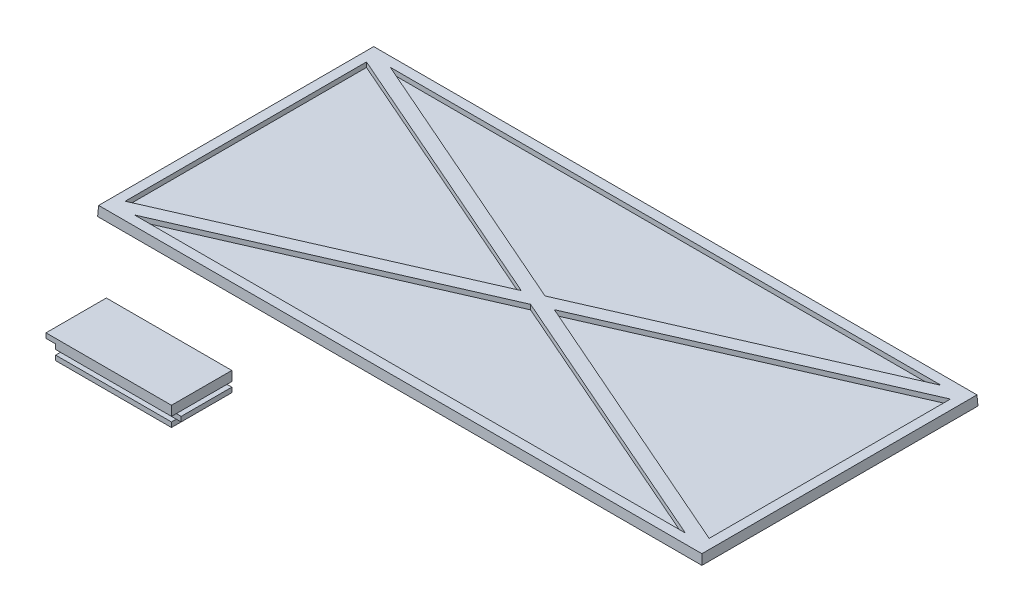
ISO-10303-21;
HEADER;
FILE_DESCRIPTION(('STEP AP214'),'2;1');
FILE_NAME('part.step','',(''),(''),'','','');
FILE_SCHEMA(('AUTOMOTIVE_DESIGN { 1 0 10303 214 1 1 1 1 }'));
ENDSEC;
DATA;
#1=APPLICATION_CONTEXT('core data for automotive mechanical design processes');
#2=APPLICATION_PROTOCOL_DEFINITION('international standard','automotive_design',2000,#1);
#3=PRODUCT_CONTEXT('',#1,'mechanical');
#4=PRODUCT('Part','Part','',(#3));
#5=PRODUCT_RELATED_PRODUCT_CATEGORY('part','',(#4));
#6=PRODUCT_DEFINITION_FORMATION('','',#4);
#7=PRODUCT_DEFINITION_CONTEXT('part definition',#1,'design');
#8=PRODUCT_DEFINITION('design','',#6,#7);
#9=PRODUCT_DEFINITION_SHAPE('','',#8);
#10=(LENGTH_UNIT() NAMED_UNIT(*) SI_UNIT(.MILLI.,.METRE.));
#11=(NAMED_UNIT(*) PLANE_ANGLE_UNIT() SI_UNIT($,.RADIAN.));
#12=(NAMED_UNIT(*) SI_UNIT($,.STERADIAN.) SOLID_ANGLE_UNIT());
#13=UNCERTAINTY_MEASURE_WITH_UNIT(LENGTH_MEASURE(1.E-05),#10,'distance_accuracy_value','');
#14=(GEOMETRIC_REPRESENTATION_CONTEXT(3) GLOBAL_UNCERTAINTY_ASSIGNED_CONTEXT((#13)) GLOBAL_UNIT_ASSIGNED_CONTEXT((#10,
#11,#12)) REPRESENTATION_CONTEXT('',''));
#15=CARTESIAN_POINT('',(0.,0.,0.));
#16=DIRECTION('',(0.,0.,1.));
#17=DIRECTION('',(1.,0.,0.));
#18=AXIS2_PLACEMENT_3D('',#15,#16,#17);
#19=CARTESIAN_POINT('',(-17.4676818513222,4.,44.2788247377734));
#20=DIRECTION('',(-1.,0.,0.));
#21=DIRECTION('',(0.,0.,1.));
#22=AXIS2_PLACEMENT_3D('',#19,#20,#21);
#23=PLANE('',#22);
#24=DIRECTION('',(0.,0.,-1.));
#25=VECTOR('',#24,1.);
#26=CARTESIAN_POINT('',(-17.4676818513222,1.,45.2788247377734));
#27=LINE('',#26,#25);
#28=CARTESIAN_POINT('',(-17.4676818513222,1.,55.7788247377734));
#29=VERTEX_POINT('',#28);
#30=CARTESIAN_POINT('',(-17.4676818513222,1.,45.2788247377734));
#31=VERTEX_POINT('',#30);
#32=EDGE_CURVE('E378',#29,#31,#27,.T.);
#33=ORIENTED_EDGE('',*,*,#32,.F.);
#34=DIRECTION('',(0.,0.,1.));
#35=VECTOR('',#34,1.);
#36=CARTESIAN_POINT('',(-17.4676818513222,1.,55.7788247377734));
#37=LINE('',#36,#35);
#38=CARTESIAN_POINT('',(-17.4676818513222,1.,56.7788247377734));
#39=VERTEX_POINT('',#38);
#40=EDGE_CURVE('E420',#29,#39,#37,.T.);
#41=ORIENTED_EDGE('',*,*,#40,.T.);
#42=DIRECTION('',(0.,-1.,0.));
#43=VECTOR('',#42,1.);
#44=CARTESIAN_POINT('',(-17.4676818513222,4.,56.7788247377734));
#45=LINE('',#44,#43);
#46=CARTESIAN_POINT('',(-17.4676818513222,0.,56.7788247377734));
#47=VERTEX_POINT('',#46);
#48=EDGE_CURVE('E338',#39,#47,#45,.T.);
#49=ORIENTED_EDGE('',*,*,#48,.T.);
#50=DIRECTION('',(0.,0.,-1.));
#51=VECTOR('',#50,1.);
#52=CARTESIAN_POINT('',(-17.4676818513222,0.,44.2788247377734));
#53=LINE('',#52,#51);
#54=CARTESIAN_POINT('',(-17.4676818513222,0.,44.2788247377734));
#55=VERTEX_POINT('',#54);
#56=EDGE_CURVE('E323',#47,#55,#53,.T.);
#57=ORIENTED_EDGE('',*,*,#56,.T.);
#58=DIRECTION('',(0.,-1.,0.));
#59=VECTOR('',#58,1.);
#60=CARTESIAN_POINT('',(-17.4676818513222,4.,44.2788247377734));
#61=LINE('',#60,#59);
#62=CARTESIAN_POINT('',(-17.4676818513222,1.,44.2788247377734));
#63=VERTEX_POINT('',#62);
#64=EDGE_CURVE('E320',#63,#55,#61,.T.);
#65=ORIENTED_EDGE('',*,*,#64,.F.);
#66=DIRECTION('',(0.,0.,-1.));
#67=VECTOR('',#66,1.);
#68=CARTESIAN_POINT('',(-17.4676818513222,1.,45.2788247377734));
#69=LINE('',#68,#67);
#70=EDGE_CURVE('E208',#31,#63,#69,.T.);
#71=ORIENTED_EDGE('',*,*,#70,.F.);
#72=EDGE_LOOP('',(#33,#41,#49,#57,#65,#71));
#73=FACE_BOUND('',#72,.T.);
#74=ADVANCED_FACE('F186',(#73),#23,.F.);
#75=DIRECTION('',(0.,0.,1.));
#76=VECTOR('',#75,1.);
#77=CARTESIAN_POINT('',(-17.4676818513222,2.,45.2788247377734));
#78=LINE('',#77,#76);
#79=CARTESIAN_POINT('',(-17.4676818513222,2.,45.2788247377734));
#80=VERTEX_POINT('',#79);
#81=CARTESIAN_POINT('',(-17.4676818513222,2.,55.7788247377734));
#82=VERTEX_POINT('',#81);
#83=EDGE_CURVE('E373',#80,#82,#78,.T.);
#84=ORIENTED_EDGE('',*,*,#83,.F.);
#85=DIRECTION('',(0.,0.,-1.));
#86=VECTOR('',#85,1.);
#87=CARTESIAN_POINT('',(-17.4676818513222,2.,45.2788247377734));
#88=LINE('',#87,#86);
#89=CARTESIAN_POINT('',(-17.4676818513222,2.,44.2788247377734));
#90=VERTEX_POINT('',#89);
#91=EDGE_CURVE('E409',#80,#90,#88,.T.);
#92=ORIENTED_EDGE('',*,*,#91,.T.);
#93=CARTESIAN_POINT('',(-17.4676818513222,4.,44.2788247377734));
#94=VERTEX_POINT('',#93);
#95=EDGE_CURVE('E335',#94,#90,#61,.T.);
#96=ORIENTED_EDGE('',*,*,#95,.F.);
#97=DIRECTION('',(0.,0.,-1.));
#98=VECTOR('',#97,1.);
#99=CARTESIAN_POINT('',(-17.4676818513222,4.,44.2788247377734));
#100=LINE('',#99,#98);
#101=CARTESIAN_POINT('',(-17.4676818513222,4.,56.7788247377734));
#102=VERTEX_POINT('',#101);
#103=EDGE_CURVE('E429',#102,#94,#100,.T.);
#104=ORIENTED_EDGE('',*,*,#103,.F.);
#105=CARTESIAN_POINT('',(-17.4676818513222,2.,56.7788247377734));
#106=VERTEX_POINT('',#105);
#107=EDGE_CURVE('E339',#102,#106,#45,.T.);
#108=ORIENTED_EDGE('',*,*,#107,.T.);
#109=DIRECTION('',(0.,0.,1.));
#110=VECTOR('',#109,1.);
#111=CARTESIAN_POINT('',(-17.4676818513222,2.,55.7788247377734));
#112=LINE('',#111,#110);
#113=EDGE_CURVE('E424',#82,#106,#112,.T.);
#114=ORIENTED_EDGE('',*,*,#113,.F.);
#115=EDGE_LOOP('',(#84,#92,#96,#104,#108,#114));
#116=FACE_BOUND('',#115,.T.);
#117=ADVANCED_FACE('F459',(#116),#23,.F.);
#118=CARTESIAN_POINT('',(-43.4676818513222,4.,44.2788247377734));
#119=DIRECTION('',(0.,0.,1.));
#120=DIRECTION('',(1.,0.,0.));
#121=AXIS2_PLACEMENT_3D('',#118,#119,#120);
#122=PLANE('',#121);
#123=DIRECTION('',(0.,-1.,0.));
#124=VECTOR('',#123,1.);
#125=CARTESIAN_POINT('',(-41.4676818513222,0.,44.2788247377734));
#126=LINE('',#125,#124);
#127=CARTESIAN_POINT('',(-41.4676818513222,3.,44.2788247377734));
#128=VERTEX_POINT('',#127);
#129=CARTESIAN_POINT('',(-41.4676818513222,2.,44.2788247377734));
#130=VERTEX_POINT('',#129);
#131=EDGE_CURVE('E306',#128,#130,#126,.T.);
#132=ORIENTED_EDGE('',*,*,#131,.F.);
#133=DIRECTION('',(-1.,0.,0.));
#134=VECTOR('',#133,1.);
#135=CARTESIAN_POINT('',(-41.4676818513222,3.,44.2788247377734));
#136=LINE('',#135,#134);
#137=CARTESIAN_POINT('',(-43.4676818513222,3.,44.2788247377734));
#138=VERTEX_POINT('',#137);
#139=EDGE_CURVE('E360',#128,#138,#136,.T.);
#140=ORIENTED_EDGE('',*,*,#139,.T.);
#141=DIRECTION('',(0.,-1.,0.));
#142=VECTOR('',#141,1.);
#143=CARTESIAN_POINT('',(-43.4676818513222,4.,44.2788247377734));
#144=LINE('',#143,#142);
#145=CARTESIAN_POINT('',(-43.4676818513222,4.,44.2788247377734));
#146=VERTEX_POINT('',#145);
#147=EDGE_CURVE('E331',#146,#138,#144,.T.);
#148=ORIENTED_EDGE('',*,*,#147,.F.);
#149=DIRECTION('',(-1.,0.,0.));
#150=VECTOR('',#149,1.);
#151=CARTESIAN_POINT('',(-43.4676818513222,4.,44.2788247377734));
#152=LINE('',#151,#150);
#153=EDGE_CURVE('E334',#94,#146,#152,.T.);
#154=ORIENTED_EDGE('',*,*,#153,.F.);
#155=ORIENTED_EDGE('',*,*,#95,.T.);
#156=DIRECTION('',(1.,0.,0.));
#157=VECTOR('',#156,1.);
#158=CARTESIAN_POINT('',(-17.4676818513222,2.,44.2788247377734));
#159=LINE('',#158,#157);
#160=EDGE_CURVE('E405',#130,#90,#159,.T.);
#161=ORIENTED_EDGE('',*,*,#160,.F.);
#162=EDGE_LOOP('',(#132,#140,#148,#154,#155,#161));
#163=FACE_BOUND('',#162,.T.);
#164=ADVANCED_FACE('F466',(#163),#122,.F.);
#165=CARTESIAN_POINT('',(-43.4676818513222,4.,56.7788247377734));
#166=DIRECTION('',(0.,0.,-1.));
#167=DIRECTION('',(-1.,0.,0.));
#168=AXIS2_PLACEMENT_3D('',#165,#166,#167);
#169=PLANE('',#168);
#170=DIRECTION('',(0.,-1.,0.));
#171=VECTOR('',#170,1.);
#172=CARTESIAN_POINT('',(-43.4676818513222,4.,56.7788247377734));
#173=LINE('',#172,#171);
#174=CARTESIAN_POINT('',(-43.4676818513222,4.,56.7788247377734));
#175=VERTEX_POINT('',#174);
#176=CARTESIAN_POINT('',(-43.4676818513222,3.,56.7788247377734));
#177=VERTEX_POINT('',#176);
#178=EDGE_CURVE('E194',#175,#177,#173,.T.);
#179=ORIENTED_EDGE('',*,*,#178,.T.);
#180=DIRECTION('',(-1.,0.,0.));
#181=VECTOR('',#180,1.);
#182=CARTESIAN_POINT('',(-41.4676818513222,3.,56.7788247377734));
#183=LINE('',#182,#181);
#184=CARTESIAN_POINT('',(-41.4676818513222,3.,56.7788247377734));
#185=VERTEX_POINT('',#184);
#186=EDGE_CURVE('E347',#185,#177,#183,.T.);
#187=ORIENTED_EDGE('',*,*,#186,.F.);
#188=DIRECTION('',(0.,1.,0.));
#189=VECTOR('',#188,1.);
#190=CARTESIAN_POINT('',(-41.4676818513222,0.,56.7788247377734));
#191=LINE('',#190,#189);
#192=CARTESIAN_POINT('',(-41.4676818513222,2.,56.7788247377734));
#193=VERTEX_POINT('',#192);
#194=EDGE_CURVE('E316',#193,#185,#191,.T.);
#195=ORIENTED_EDGE('',*,*,#194,.F.);
#196=DIRECTION('',(-1.,0.,0.));
#197=VECTOR('',#196,1.);
#198=CARTESIAN_POINT('',(-43.4676818513222,2.,56.7788247377734));
#199=LINE('',#198,#197);
#200=EDGE_CURVE('E417',#106,#193,#199,.T.);
#201=ORIENTED_EDGE('',*,*,#200,.F.);
#202=ORIENTED_EDGE('',*,*,#107,.F.);
#203=DIRECTION('',(1.,0.,0.));
#204=VECTOR('',#203,1.);
#205=CARTESIAN_POINT('',(-43.4676818513222,4.,56.7788247377734));
#206=LINE('',#205,#204);
#207=EDGE_CURVE('E326',#175,#102,#206,.T.);
#208=ORIENTED_EDGE('',*,*,#207,.F.);
#209=EDGE_LOOP('',(#179,#187,#195,#201,#202,#208));
#210=FACE_BOUND('',#209,.T.);
#211=ADVANCED_FACE('F345',(#210),#169,.F.);
#212=CARTESIAN_POINT('',(-43.4676818513222,4.,44.2788247377734));
#213=DIRECTION('',(1.,0.,0.));
#214=DIRECTION('',(0.,0.,-1.));
#215=AXIS2_PLACEMENT_3D('',#212,#213,#214);
#216=PLANE('',#215);
#217=ORIENTED_EDGE('',*,*,#147,.T.);
#218=DIRECTION('',(0.,0.,-1.));
#219=VECTOR('',#218,1.);
#220=CARTESIAN_POINT('',(-43.4676818513222,3.,44.2788247377734));
#221=LINE('',#220,#219);
#222=EDGE_CURVE('E307',#177,#138,#221,.T.);
#223=ORIENTED_EDGE('',*,*,#222,.F.);
#224=ORIENTED_EDGE('',*,*,#178,.F.);
#225=DIRECTION('',(0.,0.,1.));
#226=VECTOR('',#225,1.);
#227=CARTESIAN_POINT('',(-43.4676818513222,4.,44.2788247377734));
#228=LINE('',#227,#226);
#229=EDGE_CURVE('E322',#146,#175,#228,.T.);
#230=ORIENTED_EDGE('',*,*,#229,.F.);
#231=EDGE_LOOP('',(#217,#223,#224,#230));
#232=FACE_BOUND('',#231,.T.);
#233=ADVANCED_FACE('F188',(#232),#216,.F.);
#234=DIRECTION('',(1.,0.,0.));
#235=VECTOR('',#234,1.);
#236=CARTESIAN_POINT('',(-43.4676818513222,1.,56.7788247377734));
#237=LINE('',#236,#235);
#238=CARTESIAN_POINT('',(-41.4676818513222,1.,56.7788247377734));
#239=VERTEX_POINT('',#238);
#240=EDGE_CURVE('E412',#239,#39,#237,.T.);
#241=ORIENTED_EDGE('',*,*,#240,.F.);
#242=CARTESIAN_POINT('',(-41.4676818513222,0.,56.7788247377734));
#243=VERTEX_POINT('',#242);
#244=EDGE_CURVE('E436',#243,#239,#191,.T.);
#245=ORIENTED_EDGE('',*,*,#244,.F.);
#246=DIRECTION('',(1.,0.,0.));
#247=VECTOR('',#246,1.);
#248=CARTESIAN_POINT('',(-43.4676818513222,0.,56.7788247377734));
#249=LINE('',#248,#247);
#250=EDGE_CURVE('E315',#243,#47,#249,.T.);
#251=ORIENTED_EDGE('',*,*,#250,.T.);
#252=ORIENTED_EDGE('',*,*,#48,.F.);
#253=EDGE_LOOP('',(#241,#245,#251,#252));
#254=FACE_BOUND('',#253,.T.);
#255=ADVANCED_FACE('F435',(#254),#169,.F.);
#256=DIRECTION('',(-1.,0.,0.));
#257=VECTOR('',#256,1.);
#258=CARTESIAN_POINT('',(-43.4676818513222,0.,44.2788247377734));
#259=LINE('',#258,#257);
#260=CARTESIAN_POINT('',(-41.4676818513222,0.,44.2788247377734));
#261=VERTEX_POINT('',#260);
#262=EDGE_CURVE('E314',#55,#261,#259,.T.);
#263=ORIENTED_EDGE('',*,*,#262,.T.);
#264=CARTESIAN_POINT('',(-41.4676818513222,1.,44.2788247377734));
#265=VERTEX_POINT('',#264);
#266=EDGE_CURVE('E297',#265,#261,#126,.T.);
#267=ORIENTED_EDGE('',*,*,#266,.F.);
#268=DIRECTION('',(-1.,0.,0.));
#269=VECTOR('',#268,1.);
#270=CARTESIAN_POINT('',(-17.4676818513222,1.,44.2788247377734));
#271=LINE('',#270,#269);
#272=EDGE_CURVE('E400',#63,#265,#271,.T.);
#273=ORIENTED_EDGE('',*,*,#272,.F.);
#274=ORIENTED_EDGE('',*,*,#64,.T.);
#275=EDGE_LOOP('',(#263,#267,#273,#274));
#276=FACE_BOUND('',#275,.T.);
#277=ADVANCED_FACE('F318',(#276),#122,.F.);
#278=CARTESIAN_POINT('',(0.,4.,0.));
#279=DIRECTION('',(0.,1.,0.));
#280=DIRECTION('',(0.,0.,1.));
#281=AXIS2_PLACEMENT_3D('',#278,#279,#280);
#282=PLANE('',#281);
#283=ORIENTED_EDGE('',*,*,#229,.T.);
#284=ORIENTED_EDGE('',*,*,#207,.T.);
#285=ORIENTED_EDGE('',*,*,#103,.T.);
#286=ORIENTED_EDGE('',*,*,#153,.T.);
#287=EDGE_LOOP('',(#283,#284,#285,#286));
#288=FACE_BOUND('',#287,.T.);
#289=ADVANCED_FACE('F463',(#288),#282,.T.);
#290=CARTESIAN_POINT('',(0.,0.,0.));
#291=DIRECTION('',(0.,1.,0.));
#292=DIRECTION('',(0.,0.,1.));
#293=AXIS2_PLACEMENT_3D('',#290,#291,#292);
#294=PLANE('',#293);
#295=ORIENTED_EDGE('',*,*,#250,.F.);
#296=DIRECTION('',(0.,0.,1.));
#297=VECTOR('',#296,1.);
#298=CARTESIAN_POINT('',(-41.4676818513222,0.,44.2788247377734));
#299=LINE('',#298,#297);
#300=EDGE_CURVE('E300',#261,#243,#299,.T.);
#301=ORIENTED_EDGE('',*,*,#300,.F.);
#302=ORIENTED_EDGE('',*,*,#262,.F.);
#303=ORIENTED_EDGE('',*,*,#56,.F.);
#304=EDGE_LOOP('',(#295,#301,#302,#303));
#305=FACE_BOUND('',#304,.T.);
#306=ADVANCED_FACE('F312',(#305),#294,.F.);
#307=CARTESIAN_POINT('',(-43.4676818513222,2.,55.7788247377734));
#308=DIRECTION('',(0.,1.,0.));
#309=DIRECTION('',(0.,0.,1.));
#310=AXIS2_PLACEMENT_3D('',#307,#308,#309);
#311=PLANE('',#310);
#312=ORIENTED_EDGE('',*,*,#200,.T.);
#313=DIRECTION('',(0.,0.,-1.));
#314=VECTOR('',#313,1.);
#315=CARTESIAN_POINT('',(-41.4676818513222,2.,55.7788247377734));
#316=LINE('',#315,#314);
#317=CARTESIAN_POINT('',(-41.4676818513222,2.,55.7788247377734));
#318=VERTEX_POINT('',#317);
#319=EDGE_CURVE('E370',#193,#318,#316,.T.);
#320=ORIENTED_EDGE('',*,*,#319,.T.);
#321=DIRECTION('',(-1.,0.,0.));
#322=VECTOR('',#321,1.);
#323=CARTESIAN_POINT('',(-43.4676818513222,2.,55.7788247377734));
#324=LINE('',#323,#322);
#325=EDGE_CURVE('E416',#82,#318,#324,.T.);
#326=ORIENTED_EDGE('',*,*,#325,.F.);
#327=ORIENTED_EDGE('',*,*,#113,.T.);
#328=EDGE_LOOP('',(#312,#320,#326,#327));
#329=FACE_BOUND('',#328,.T.);
#330=ADVANCED_FACE('F454',(#329),#311,.F.);
#331=CARTESIAN_POINT('',(-43.4676818513222,1.,55.7788247377734));
#332=DIRECTION('',(0.,-1.,0.));
#333=DIRECTION('',(0.,0.,-1.));
#334=AXIS2_PLACEMENT_3D('',#331,#332,#333);
#335=PLANE('',#334);
#336=DIRECTION('',(1.,0.,0.));
#337=VECTOR('',#336,1.);
#338=CARTESIAN_POINT('',(-43.4676818513222,1.,55.7788247377734));
#339=LINE('',#338,#337);
#340=CARTESIAN_POINT('',(-41.4676818513222,1.,55.7788247377734));
#341=VERTEX_POINT('',#340);
#342=EDGE_CURVE('E414',#341,#29,#339,.T.);
#343=ORIENTED_EDGE('',*,*,#342,.F.);
#344=DIRECTION('',(0.,0.,1.));
#345=VECTOR('',#344,1.);
#346=CARTESIAN_POINT('',(-41.4676818513222,1.,55.7788247377734));
#347=LINE('',#346,#345);
#348=EDGE_CURVE('E367',#341,#239,#347,.T.);
#349=ORIENTED_EDGE('',*,*,#348,.T.);
#350=ORIENTED_EDGE('',*,*,#240,.T.);
#351=ORIENTED_EDGE('',*,*,#40,.F.);
#352=EDGE_LOOP('',(#343,#349,#350,#351));
#353=FACE_BOUND('',#352,.T.);
#354=ADVANCED_FACE('F442',(#353),#335,.F.);
#355=CARTESIAN_POINT('',(0.,0.,55.7788247377734));
#356=DIRECTION('',(0.,0.,1.));
#357=DIRECTION('',(1.,0.,0.));
#358=AXIS2_PLACEMENT_3D('',#355,#356,#357);
#359=PLANE('',#358);
#360=DIRECTION('',(0.,1.,0.));
#361=VECTOR('',#360,1.);
#362=CARTESIAN_POINT('',(-41.4676818513222,0.,55.7788247377734));
#363=LINE('',#362,#361);
#364=EDGE_CURVE('E365',#341,#318,#363,.T.);
#365=ORIENTED_EDGE('',*,*,#364,.F.);
#366=ORIENTED_EDGE('',*,*,#342,.T.);
#367=DIRECTION('',(-1.,0.,0.));
#368=VECTOR('',#367,1.);
#369=CARTESIAN_POINT('',(-16.4676818513222,1.,55.7788247377734));
#370=LINE('',#369,#368);
#371=CARTESIAN_POINT('',(-16.4676818513222,1.,55.7788247377734));
#372=VERTEX_POINT('',#371);
#373=EDGE_CURVE('E391',#372,#29,#370,.T.);
#374=ORIENTED_EDGE('',*,*,#373,.F.);
#375=DIRECTION('',(0.,-1.,0.));
#376=VECTOR('',#375,1.);
#377=CARTESIAN_POINT('',(-16.4676818513222,2.,55.7788247377734));
#378=LINE('',#377,#376);
#379=CARTESIAN_POINT('',(-16.4676818513222,2.,55.7788247377734));
#380=VERTEX_POINT('',#379);
#381=EDGE_CURVE('E380',#380,#372,#378,.T.);
#382=ORIENTED_EDGE('',*,*,#381,.F.);
#383=DIRECTION('',(-1.,0.,0.));
#384=VECTOR('',#383,1.);
#385=CARTESIAN_POINT('',(-16.4676818513222,2.,55.7788247377734));
#386=LINE('',#385,#384);
#387=EDGE_CURVE('E394',#380,#82,#386,.T.);
#388=ORIENTED_EDGE('',*,*,#387,.T.);
#389=ORIENTED_EDGE('',*,*,#325,.T.);
#390=EDGE_LOOP('',(#365,#366,#374,#382,#388,#389));
#391=FACE_BOUND('',#390,.T.);
#392=ADVANCED_FACE('F451',(#391),#359,.T.);
#393=CARTESIAN_POINT('',(-17.4676818513222,2.,45.2788247377734));
#394=DIRECTION('',(0.,1.,0.));
#395=DIRECTION('',(0.,0.,1.));
#396=AXIS2_PLACEMENT_3D('',#393,#394,#395);
#397=PLANE('',#396);
#398=DIRECTION('',(1.,0.,0.));
#399=VECTOR('',#398,1.);
#400=CARTESIAN_POINT('',(-17.4676818513222,2.,45.2788247377734));
#401=LINE('',#400,#399);
#402=CARTESIAN_POINT('',(-41.4676818513222,2.,45.2788247377734));
#403=VERTEX_POINT('',#402);
#404=EDGE_CURVE('E404',#403,#80,#401,.T.);
#405=ORIENTED_EDGE('',*,*,#404,.F.);
#406=DIRECTION('',(0.,0.,-1.));
#407=VECTOR('',#406,1.);
#408=CARTESIAN_POINT('',(-41.4676818513222,2.,45.2788247377734));
#409=LINE('',#408,#407);
#410=EDGE_CURVE('E200',#403,#130,#409,.T.);
#411=ORIENTED_EDGE('',*,*,#410,.T.);
#412=ORIENTED_EDGE('',*,*,#160,.T.);
#413=ORIENTED_EDGE('',*,*,#91,.F.);
#414=EDGE_LOOP('',(#405,#411,#412,#413));
#415=FACE_BOUND('',#414,.T.);
#416=ADVANCED_FACE('F473',(#415),#397,.F.);
#417=CARTESIAN_POINT('',(-17.4676818513222,1.,45.2788247377734));
#418=DIRECTION('',(0.,-1.,0.));
#419=DIRECTION('',(0.,0.,-1.));
#420=AXIS2_PLACEMENT_3D('',#417,#418,#419);
#421=PLANE('',#420);
#422=ORIENTED_EDGE('',*,*,#272,.T.);
#423=DIRECTION('',(0.,0.,1.));
#424=VECTOR('',#423,1.);
#425=CARTESIAN_POINT('',(-41.4676818513222,1.,45.2788247377734));
#426=LINE('',#425,#424);
#427=CARTESIAN_POINT('',(-41.4676818513222,1.,45.2788247377734));
#428=VERTEX_POINT('',#427);
#429=EDGE_CURVE('E303',#265,#428,#426,.T.);
#430=ORIENTED_EDGE('',*,*,#429,.T.);
#431=DIRECTION('',(-1.,0.,0.));
#432=VECTOR('',#431,1.);
#433=CARTESIAN_POINT('',(-17.4676818513222,1.,45.2788247377734));
#434=LINE('',#433,#432);
#435=EDGE_CURVE('E401',#31,#428,#434,.T.);
#436=ORIENTED_EDGE('',*,*,#435,.F.);
#437=ORIENTED_EDGE('',*,*,#70,.T.);
#438=EDGE_LOOP('',(#422,#430,#436,#437));
#439=FACE_BOUND('',#438,.T.);
#440=ADVANCED_FACE('F484',(#439),#421,.F.);
#441=CARTESIAN_POINT('',(0.,0.,45.2788247377734));
#442=DIRECTION('',(0.,0.,-1.));
#443=DIRECTION('',(-1.,0.,0.));
#444=AXIS2_PLACEMENT_3D('',#441,#442,#443);
#445=PLANE('',#444);
#446=DIRECTION('',(0.,-1.,0.));
#447=VECTOR('',#446,1.);
#448=CARTESIAN_POINT('',(-41.4676818513222,0.,45.2788247377734));
#449=LINE('',#448,#447);
#450=EDGE_CURVE('E13',#403,#428,#449,.T.);
#451=ORIENTED_EDGE('',*,*,#450,.F.);
#452=ORIENTED_EDGE('',*,*,#404,.T.);
#453=DIRECTION('',(-1.,0.,0.));
#454=VECTOR('',#453,1.);
#455=CARTESIAN_POINT('',(-16.4676818513222,2.,45.2788247377734));
#456=LINE('',#455,#454);
#457=CARTESIAN_POINT('',(-16.4676818513222,2.,45.2788247377734));
#458=VERTEX_POINT('',#457);
#459=EDGE_CURVE('E397',#458,#80,#456,.T.);
#460=ORIENTED_EDGE('',*,*,#459,.F.);
#461=DIRECTION('',(0.,1.,0.));
#462=VECTOR('',#461,1.);
#463=CARTESIAN_POINT('',(-16.4676818513222,2.,45.2788247377734));
#464=LINE('',#463,#462);
#465=CARTESIAN_POINT('',(-16.4676818513222,1.,45.2788247377734));
#466=VERTEX_POINT('',#465);
#467=EDGE_CURVE('E374',#466,#458,#464,.T.);
#468=ORIENTED_EDGE('',*,*,#467,.F.);
#469=DIRECTION('',(-1.,0.,0.));
#470=VECTOR('',#469,1.);
#471=CARTESIAN_POINT('',(-16.4676818513222,1.,45.2788247377734));
#472=LINE('',#471,#470);
#473=EDGE_CURVE('E384',#466,#31,#472,.T.);
#474=ORIENTED_EDGE('',*,*,#473,.T.);
#475=ORIENTED_EDGE('',*,*,#435,.T.);
#476=EDGE_LOOP('',(#451,#452,#460,#468,#474,#475));
#477=FACE_BOUND('',#476,.T.);
#478=ADVANCED_FACE('F477',(#477),#445,.T.);
#479=CARTESIAN_POINT('',(-16.4676818513222,2.,45.2788247377734));
#480=DIRECTION('',(0.,-1.,0.));
#481=DIRECTION('',(0.,0.,-1.));
#482=AXIS2_PLACEMENT_3D('',#479,#480,#481);
#483=PLANE('',#482);
#484=ORIENTED_EDGE('',*,*,#83,.T.);
#485=ORIENTED_EDGE('',*,*,#387,.F.);
#486=DIRECTION('',(0.,0.,1.));
#487=VECTOR('',#486,1.);
#488=CARTESIAN_POINT('',(-16.4676818513222,2.,45.2788247377734));
#489=LINE('',#488,#487);
#490=EDGE_CURVE('E377',#458,#380,#489,.T.);
#491=ORIENTED_EDGE('',*,*,#490,.F.);
#492=ORIENTED_EDGE('',*,*,#459,.T.);
#493=EDGE_LOOP('',(#484,#485,#491,#492));
#494=FACE_BOUND('',#493,.T.);
#495=ADVANCED_FACE('F481',(#494),#483,.F.);
#496=CARTESIAN_POINT('',(-16.4676818513222,1.,45.2788247377734));
#497=DIRECTION('',(0.,1.,0.));
#498=DIRECTION('',(0.,0.,1.));
#499=AXIS2_PLACEMENT_3D('',#496,#497,#498);
#500=PLANE('',#499);
#501=ORIENTED_EDGE('',*,*,#32,.T.);
#502=ORIENTED_EDGE('',*,*,#473,.F.);
#503=DIRECTION('',(0.,0.,-1.));
#504=VECTOR('',#503,1.);
#505=CARTESIAN_POINT('',(-16.4676818513222,1.,45.2788247377734));
#506=LINE('',#505,#504);
#507=EDGE_CURVE('E382',#372,#466,#506,.T.);
#508=ORIENTED_EDGE('',*,*,#507,.F.);
#509=ORIENTED_EDGE('',*,*,#373,.T.);
#510=EDGE_LOOP('',(#501,#502,#508,#509));
#511=FACE_BOUND('',#510,.T.);
#512=ADVANCED_FACE('F446',(#511),#500,.F.);
#513=CARTESIAN_POINT('',(-16.4676818513222,0.,0.));
#514=DIRECTION('',(-1.,0.,0.));
#515=DIRECTION('',(0.,0.,1.));
#516=AXIS2_PLACEMENT_3D('',#513,#514,#515);
#517=PLANE('',#516);
#518=ORIENTED_EDGE('',*,*,#467,.T.);
#519=ORIENTED_EDGE('',*,*,#490,.T.);
#520=ORIENTED_EDGE('',*,*,#381,.T.);
#521=ORIENTED_EDGE('',*,*,#507,.T.);
#522=EDGE_LOOP('',(#518,#519,#520,#521));
#523=FACE_BOUND('',#522,.T.);
#524=ADVANCED_FACE('F483',(#523),#517,.F.);
#525=CARTESIAN_POINT('',(-41.4676818513222,0.,0.));
#526=DIRECTION('',(1.,0.,0.));
#527=DIRECTION('',(0.,0.,-1.));
#528=AXIS2_PLACEMENT_3D('',#525,#526,#527);
#529=PLANE('',#528);
#530=ORIENTED_EDGE('',*,*,#194,.T.);
#531=DIRECTION('',(0.,0.,-1.));
#532=VECTOR('',#531,1.);
#533=CARTESIAN_POINT('',(-41.4676818513222,3.,44.2788247377734));
#534=LINE('',#533,#532);
#535=EDGE_CURVE('E358',#185,#128,#534,.T.);
#536=ORIENTED_EDGE('',*,*,#535,.T.);
#537=ORIENTED_EDGE('',*,*,#131,.T.);
#538=ORIENTED_EDGE('',*,*,#410,.F.);
#539=ORIENTED_EDGE('',*,*,#450,.T.);
#540=ORIENTED_EDGE('',*,*,#429,.F.);
#541=ORIENTED_EDGE('',*,*,#266,.T.);
#542=ORIENTED_EDGE('',*,*,#300,.T.);
#543=ORIENTED_EDGE('',*,*,#244,.T.);
#544=ORIENTED_EDGE('',*,*,#348,.F.);
#545=ORIENTED_EDGE('',*,*,#364,.T.);
#546=ORIENTED_EDGE('',*,*,#319,.F.);
#547=EDGE_LOOP('',(#530,#536,#537,#538,#539,#540,#541,#542,#543,#544,#545,#546));
#548=FACE_BOUND('',#547,.T.);
#549=ADVANCED_FACE('F299',(#548),#529,.F.);
#550=CARTESIAN_POINT('',(-41.4676818513222,3.,44.2788247377734));
#551=DIRECTION('',(0.,1.,0.));
#552=DIRECTION('',(0.,0.,1.));
#553=AXIS2_PLACEMENT_3D('',#550,#551,#552);
#554=PLANE('',#553);
#555=ORIENTED_EDGE('',*,*,#222,.T.);
#556=ORIENTED_EDGE('',*,*,#139,.F.);
#557=ORIENTED_EDGE('',*,*,#535,.F.);
#558=ORIENTED_EDGE('',*,*,#186,.T.);
#559=EDGE_LOOP('',(#555,#556,#557,#558));
#560=FACE_BOUND('',#559,.T.);
#561=ADVANCED_FACE('F470',(#560),#554,.F.);
#562=CLOSED_SHELL('',(#74,#117,#164,#211,#233,#255,#277,#289,#306,#330,#354,#392,#416,#440,#478,
#495,#512,#524,#549,#561));
#563=MANIFOLD_SOLID_BREP('B2',#562);
#564=CARTESIAN_POINT('',(0.,0.,0.));
#565=DIRECTION('',(0.,1.,0.));
#566=DIRECTION('',(0.,0.,1.));
#567=AXIS2_PLACEMENT_3D('',#564,#565,#566);
#568=PLANE('',#567);
#569=DIRECTION('',(0.,0.,1.));
#570=VECTOR('',#569,1.);
#571=CARTESIAN_POINT('',(62.2270115443985,0.,0.));
#572=LINE('',#571,#570);
#573=CARTESIAN_POINT('',(62.2270115443985,0.,26.5670351571493));
#574=VERTEX_POINT('',#573);
#575=CARTESIAN_POINT('',(62.2270115443985,0.,-30.6425959599828));
#576=VERTEX_POINT('',#575);
#577=EDGE_CURVE('E884',#574,#576,#572,.F.);
#578=ORIENTED_EDGE('',*,*,#577,.F.);
#579=DIRECTION('',(-1.,0.,0.));
#580=VECTOR('',#579,1.);
#581=CARTESIAN_POINT('',(0.,0.,26.5670351571493));
#582=LINE('',#581,#580);
#583=CARTESIAN_POINT('',(-62.9826195727337,0.,26.5670351571493));
#584=VERTEX_POINT('',#583);
#585=EDGE_CURVE('E879',#574,#584,#582,.T.);
#586=ORIENTED_EDGE('',*,*,#585,.T.);
#587=DIRECTION('',(0.,0.,-1.));
#588=VECTOR('',#587,1.);
#589=CARTESIAN_POINT('',(-62.9826195727337,0.,0.));
#590=LINE('',#589,#588);
#591=CARTESIAN_POINT('',(-62.9826195727337,0.,-30.6425959599828));
#592=VERTEX_POINT('',#591);
#593=EDGE_CURVE('E653',#584,#592,#590,.T.);
#594=ORIENTED_EDGE('',*,*,#593,.T.);
#595=DIRECTION('',(1.,0.,0.));
#596=VECTOR('',#595,1.);
#597=CARTESIAN_POINT('',(0.,0.,-30.6425959599828));
#598=LINE('',#597,#596);
#599=EDGE_CURVE('E885',#576,#592,#598,.F.);
#600=ORIENTED_EDGE('',*,*,#599,.F.);
#601=EDGE_LOOP('',(#578,#586,#594,#600));
#602=FACE_BOUND('',#601,.T.);
#603=ADVANCED_FACE('F650',(#602),#568,.F.);
#604=CARTESIAN_POINT('',(62.1221959858324,2.,0.));
#605=DIRECTION('',(-0.998629534754574,-0.0523359562429438,0.));
#606=DIRECTION('',(0.0523359562429438,-0.998629534754574,0.));
#607=AXIS2_PLACEMENT_3D('',#604,#605,#606);
#608=PLANE('',#607);
#609=DIRECTION('',(0.,0.,-1.));
#610=VECTOR('',#609,1.);
#611=CARTESIAN_POINT('',(62.1221959858324,2.,0.));
#612=LINE('',#611,#610);
#613=CARTESIAN_POINT('',(62.1221959858324,2.,26.4622195985832));
#614=VERTEX_POINT('',#613);
#615=CARTESIAN_POINT('',(62.1221959858324,2.,-30.5377804014168));
#616=VERTEX_POINT('',#615);
#617=EDGE_CURVE('E870',#614,#616,#612,.T.);
#618=ORIENTED_EDGE('',*,*,#617,.F.);
#619=DIRECTION('',(0.0522644276887139,-0.997264688634237,0.0522644276887139));
#620=VECTOR('',#619,1.);
#621=CARTESIAN_POINT('',(62.0499125700155,3.37924973745801,26.3899361827663));
#622=LINE('',#621,#620);
#623=EDGE_CURVE('E184',#574,#614,#622,.F.);
#624=ORIENTED_EDGE('',*,*,#623,.F.);
#625=ORIENTED_EDGE('',*,*,#577,.T.);
#626=DIRECTION('',(-0.0522644276887139,0.997264688634237,0.0522644276887139));
#627=VECTOR('',#626,1.);
#628=CARTESIAN_POINT('',(62.0387798887564,3.59167395026301,-30.4543643043408));
#629=LINE('',#628,#627);
#630=EDGE_CURVE('E877',#576,#616,#629,.T.);
#631=ORIENTED_EDGE('',*,*,#630,.T.);
#632=EDGE_LOOP('',(#618,#624,#625,#631));
#633=FACE_BOUND('',#632,.T.);
#634=ADVANCED_FACE('F905',(#633),#608,.F.);
#635=CARTESIAN_POINT('',(0.,2.,26.4622195985832));
#636=DIRECTION('',(0.,-0.0523359562429438,-0.998629534754574));
#637=DIRECTION('',(0.,0.998629534754574,-0.0523359562429438));
#638=AXIS2_PLACEMENT_3D('',#635,#636,#637);
#639=PLANE('',#638);
#640=DIRECTION('',(-1.,0.,0.));
#641=VECTOR('',#640,1.);
#642=CARTESIAN_POINT('',(0.,2.,26.4622195985832));
#643=LINE('',#642,#641);
#644=CARTESIAN_POINT('',(-62.8778040141676,2.,26.4622195985832));
#645=VERTEX_POINT('',#644);
#646=EDGE_CURVE('E867',#614,#645,#643,.T.);
#647=ORIENTED_EDGE('',*,*,#646,.T.);
#648=DIRECTION('',(0.0522644276887139,0.997264688634237,-0.0522644276887139));
#649=VECTOR('',#648,1.);
#650=CARTESIAN_POINT('',(-62.8055205983507,3.379249737458,26.3899361827663));
#651=LINE('',#650,#649);
#652=EDGE_CURVE('E658',#584,#645,#651,.T.);
#653=ORIENTED_EDGE('',*,*,#652,.F.);
#654=ORIENTED_EDGE('',*,*,#585,.F.);
#655=ORIENTED_EDGE('',*,*,#623,.T.);
#656=EDGE_LOOP('',(#647,#653,#654,#655));
#657=FACE_BOUND('',#656,.T.);
#658=ADVANCED_FACE('F907',(#657),#639,.F.);
#659=CARTESIAN_POINT('',(-62.8778040141676,2.,0.));
#660=DIRECTION('',(0.998629534754574,-0.0523359562429438,0.));
#661=DIRECTION('',(0.0523359562429438,0.998629534754574,0.));
#662=AXIS2_PLACEMENT_3D('',#659,#660,#661);
#663=PLANE('',#662);
#664=DIRECTION('',(0.,0.,-1.));
#665=VECTOR('',#664,1.);
#666=CARTESIAN_POINT('',(-62.8778040141676,2.,0.));
#667=LINE('',#666,#665);
#668=CARTESIAN_POINT('',(-62.8778040141676,2.,-30.5377804014168));
#669=VERTEX_POINT('',#668);
#670=EDGE_CURVE('E860',#645,#669,#667,.T.);
#671=ORIENTED_EDGE('',*,*,#670,.T.);
#672=DIRECTION('',(-0.0522644276887139,-0.997264688634237,-0.0522644276887139));
#673=VECTOR('',#672,1.);
#674=CARTESIAN_POINT('',(-62.7943879170917,3.59167395026301,-30.4543643043408));
#675=LINE('',#674,#673);
#676=EDGE_CURVE('E876',#592,#669,#675,.F.);
#677=ORIENTED_EDGE('',*,*,#676,.F.);
#678=ORIENTED_EDGE('',*,*,#593,.F.);
#679=ORIENTED_EDGE('',*,*,#652,.T.);
#680=EDGE_LOOP('',(#671,#677,#678,#679));
#681=FACE_BOUND('',#680,.T.);
#682=ADVANCED_FACE('F896',(#681),#663,.F.);
#683=CARTESIAN_POINT('',(0.,2.,-30.5377804014168));
#684=DIRECTION('',(0.,-0.0523359562429438,0.998629534754574));
#685=DIRECTION('',(0.,-0.998629534754574,-0.0523359562429438));
#686=AXIS2_PLACEMENT_3D('',#683,#684,#685);
#687=PLANE('',#686);
#688=DIRECTION('',(-1.,0.,0.));
#689=VECTOR('',#688,1.);
#690=CARTESIAN_POINT('',(0.,2.,-30.5377804014168));
#691=LINE('',#690,#689);
#692=EDGE_CURVE('E866',#616,#669,#691,.T.);
#693=ORIENTED_EDGE('',*,*,#692,.F.);
#694=ORIENTED_EDGE('',*,*,#630,.F.);
#695=ORIENTED_EDGE('',*,*,#599,.T.);
#696=ORIENTED_EDGE('',*,*,#676,.T.);
#697=EDGE_LOOP('',(#693,#694,#695,#696));
#698=FACE_BOUND('',#697,.T.);
#699=ADVANCED_FACE('F899',(#698),#687,.F.);
#700=CARTESIAN_POINT('',(0.,2.,0.));
#701=DIRECTION('',(0.,1.,0.));
#702=DIRECTION('',(0.,0.,1.));
#703=AXIS2_PLACEMENT_3D('',#700,#701,#702);
#704=PLANE('',#703);
#705=DIRECTION('',(0.915983508566402,0.,0.401215916975366));
#706=VECTOR('',#705,1.);
#707=CARTESIAN_POINT('',(-57.4532757122808,2.,-28.5377804014168));
#708=LINE('',#707,#706);
#709=CARTESIAN_POINT('',(-57.4532757122808,2.,-28.5377804014168));
#710=VERTEX_POINT('',#709);
#711=CARTESIAN_POINT('',(-0.377804014167527,2.,-3.53778040141674));
#712=VERTEX_POINT('',#711);
#713=EDGE_CURVE('E666',#710,#712,#708,.T.);
#714=ORIENTED_EDGE('',*,*,#713,.F.);
#715=DIRECTION('',(-1.,0.,0.));
#716=VECTOR('',#715,1.);
#717=CARTESIAN_POINT('',(-57.4532757122808,2.,-28.5377804014168));
#718=LINE('',#717,#716);
#719=CARTESIAN_POINT('',(56.6976676839459,2.,-28.5377804014168));
#720=VERTEX_POINT('',#719);
#721=EDGE_CURVE('E800',#720,#710,#718,.T.);
#722=ORIENTED_EDGE('',*,*,#721,.F.);
#723=DIRECTION('',(0.915983508566402,0.,-0.401215916975365));
#724=VECTOR('',#723,1.);
#725=CARTESIAN_POINT('',(-0.377804014167527,2.,-3.53778040141674));
#726=LINE('',#725,#724);
#727=EDGE_CURVE('E808',#712,#720,#726,.T.);
#728=ORIENTED_EDGE('',*,*,#727,.F.);
#729=EDGE_LOOP('',(#714,#722,#728));
#730=FACE_BOUND('',#729,.T.);
#731=DIRECTION('',(-0.915983508566402,0.,0.401215916975366));
#732=VECTOR('',#731,1.);
#733=CARTESIAN_POINT('',(3.04672428771917,2.,-2.03778040141679));
#734=LINE('',#733,#732);
#735=CARTESIAN_POINT('',(60.1221959858324,2.,-27.0377804014168));
#736=VERTEX_POINT('',#735);
#737=CARTESIAN_POINT('',(3.04672428771917,2.,-2.03778040141679));
#738=VERTEX_POINT('',#737);
#739=EDGE_CURVE('E674',#736,#738,#734,.T.);
#740=ORIENTED_EDGE('',*,*,#739,.F.);
#741=DIRECTION('',(0.,0.,-1.));
#742=VECTOR('',#741,1.);
#743=CARTESIAN_POINT('',(60.1221959858324,2.,22.9622195985832));
#744=LINE('',#743,#742);
#745=CARTESIAN_POINT('',(60.1221959858324,2.,22.9622195985832));
#746=VERTEX_POINT('',#745);
#747=EDGE_CURVE('E822',#746,#736,#744,.T.);
#748=ORIENTED_EDGE('',*,*,#747,.F.);
#749=DIRECTION('',(0.915983508566402,0.,0.401215916975366));
#750=VECTOR('',#749,1.);
#751=CARTESIAN_POINT('',(3.04672428771917,2.,-2.03778040141679));
#752=LINE('',#751,#750);
#753=EDGE_CURVE('E830',#738,#746,#752,.T.);
#754=ORIENTED_EDGE('',*,*,#753,.F.);
#755=EDGE_LOOP('',(#740,#748,#754));
#756=FACE_BOUND('',#755,.T.);
#757=DIRECTION('',(0.915983508566402,0.,-0.401215916975365));
#758=VECTOR('',#757,1.);
#759=CARTESIAN_POINT('',(-60.8778040141676,2.,22.9622195985832));
#760=LINE('',#759,#758);
#761=CARTESIAN_POINT('',(-60.8778040141676,2.,22.9622195985832));
#762=VERTEX_POINT('',#761);
#763=CARTESIAN_POINT('',(-3.80233231605434,2.,-2.03778040141673));
#764=VERTEX_POINT('',#763);
#765=EDGE_CURVE('E770',#762,#764,#760,.T.);
#766=ORIENTED_EDGE('',*,*,#765,.F.);
#767=DIRECTION('',(0.,0.,1.));
#768=VECTOR('',#767,1.);
#769=CARTESIAN_POINT('',(-60.8778040141676,2.,22.9622195985832));
#770=LINE('',#769,#768);
#771=CARTESIAN_POINT('',(-60.8778040141676,2.,-27.0377804014168));
#772=VERTEX_POINT('',#771);
#773=EDGE_CURVE('E784',#772,#762,#770,.T.);
#774=ORIENTED_EDGE('',*,*,#773,.F.);
#775=DIRECTION('',(-0.915983508566402,0.,-0.401215916975366));
#776=VECTOR('',#775,1.);
#777=CARTESIAN_POINT('',(-60.8778040141676,2.,-27.0377804014168));
#778=LINE('',#777,#776);
#779=EDGE_CURVE('E787',#764,#772,#778,.T.);
#780=ORIENTED_EDGE('',*,*,#779,.F.);
#781=EDGE_LOOP('',(#766,#774,#780));
#782=FACE_BOUND('',#781,.T.);
#783=DIRECTION('',(-0.915983508566403,0.,0.401215916975365));
#784=VECTOR('',#783,1.);
#785=CARTESIAN_POINT('',(-57.4532757122811,2.,24.4622195985832));
#786=LINE('',#785,#784);
#787=CARTESIAN_POINT('',(-0.377804014167666,2.,-0.537780401416785));
#788=VERTEX_POINT('',#787);
#789=CARTESIAN_POINT('',(-57.4532757122811,2.,24.4622195985832));
#790=VERTEX_POINT('',#789);
#791=EDGE_CURVE('E837',#788,#790,#786,.T.);
#792=ORIENTED_EDGE('',*,*,#791,.F.);
#793=DIRECTION('',(-0.915983508566402,0.,-0.401215916975366));
#794=VECTOR('',#793,1.);
#795=CARTESIAN_POINT('',(-0.377804014167666,2.,-0.537780401416785));
#796=LINE('',#795,#794);
#797=CARTESIAN_POINT('',(56.6976676839456,2.,24.4622195985832));
#798=VERTEX_POINT('',#797);
#799=EDGE_CURVE('E845',#798,#788,#796,.T.);
#800=ORIENTED_EDGE('',*,*,#799,.F.);
#801=DIRECTION('',(1.,0.,0.));
#802=VECTOR('',#801,1.);
#803=CARTESIAN_POINT('',(-57.4532757122811,2.,24.4622195985832));
#804=LINE('',#803,#802);
#805=EDGE_CURVE('E853',#790,#798,#804,.T.);
#806=ORIENTED_EDGE('',*,*,#805,.F.);
#807=EDGE_LOOP('',(#792,#800,#806));
#808=FACE_BOUND('',#807,.T.);
#809=ORIENTED_EDGE('',*,*,#646,.F.);
#810=ORIENTED_EDGE('',*,*,#617,.T.);
#811=ORIENTED_EDGE('',*,*,#692,.T.);
#812=ORIENTED_EDGE('',*,*,#670,.F.);
#813=EDGE_LOOP('',(#809,#810,#811,#812));
#814=FACE_BOUND('',#813,.T.);
#815=ADVANCED_FACE('F902',(#730,#756,#782,#808,#814),#704,.T.);
#816=CARTESIAN_POINT('',(-57.4532757122811,1.,24.4622195985832));
#817=DIRECTION('',(-0.401215916975365,0.,-0.915983508566402));
#818=DIRECTION('',(-0.915983508566403,0.,0.401215916975365));
#819=AXIS2_PLACEMENT_3D('',#816,#817,#818);
#820=PLANE('',#819);
#821=ORIENTED_EDGE('',*,*,#791,.T.);
#822=DIRECTION('',(0.,1.,0.));
#823=VECTOR('',#822,1.);
#824=CARTESIAN_POINT('',(-57.4532757122811,1.,24.4622195985832));
#825=LINE('',#824,#823);
#826=CARTESIAN_POINT('',(-57.4532757122811,1.,24.4622195985832));
#827=VERTEX_POINT('',#826);
#828=EDGE_CURVE('E851',#827,#790,#825,.T.);
#829=ORIENTED_EDGE('',*,*,#828,.F.);
#830=DIRECTION('',(-0.915983508566403,0.,0.401215916975365));
#831=VECTOR('',#830,1.);
#832=CARTESIAN_POINT('',(-57.4532757122811,1.,24.4622195985832));
#833=LINE('',#832,#831);
#834=CARTESIAN_POINT('',(-0.377804014167666,1.,-0.537780401416785));
#835=VERTEX_POINT('',#834);
#836=EDGE_CURVE('E841',#835,#827,#833,.T.);
#837=ORIENTED_EDGE('',*,*,#836,.F.);
#838=DIRECTION('',(0.,1.,0.));
#839=VECTOR('',#838,1.);
#840=CARTESIAN_POINT('',(-0.377804014167666,1.,-0.537780401416785));
#841=LINE('',#840,#839);
#842=EDGE_CURVE('E858',#835,#788,#841,.T.);
#843=ORIENTED_EDGE('',*,*,#842,.T.);
#844=EDGE_LOOP('',(#821,#829,#837,#843));
#845=FACE_BOUND('',#844,.T.);
#846=ADVANCED_FACE('F952',(#845),#820,.F.);
#847=CARTESIAN_POINT('',(-0.377804014167666,1.,-0.537780401416785));
#848=DIRECTION('',(0.401215916975366,0.,-0.915983508566402));
#849=DIRECTION('',(-0.915983508566402,0.,-0.401215916975366));
#850=AXIS2_PLACEMENT_3D('',#847,#848,#849);
#851=PLANE('',#850);
#852=ORIENTED_EDGE('',*,*,#799,.T.);
#853=ORIENTED_EDGE('',*,*,#842,.F.);
#854=DIRECTION('',(-0.915983508566402,0.,-0.401215916975366));
#855=VECTOR('',#854,1.);
#856=CARTESIAN_POINT('',(-0.377804014167666,1.,-0.537780401416785));
#857=LINE('',#856,#855);
#858=CARTESIAN_POINT('',(56.6976676839456,1.,24.4622195985832));
#859=VERTEX_POINT('',#858);
#860=EDGE_CURVE('E848',#859,#835,#857,.T.);
#861=ORIENTED_EDGE('',*,*,#860,.F.);
#862=DIRECTION('',(0.,1.,0.));
#863=VECTOR('',#862,1.);
#864=CARTESIAN_POINT('',(56.6976676839456,1.,24.4622195985832));
#865=LINE('',#864,#863);
#866=EDGE_CURVE('E861',#859,#798,#865,.T.);
#867=ORIENTED_EDGE('',*,*,#866,.T.);
#868=EDGE_LOOP('',(#852,#853,#861,#867));
#869=FACE_BOUND('',#868,.T.);
#870=ADVANCED_FACE('F960',(#869),#851,.F.);
#871=CARTESIAN_POINT('',(-57.4532757122811,1.,24.4622195985832));
#872=DIRECTION('',(0.,0.,1.));
#873=DIRECTION('',(1.,0.,0.));
#874=AXIS2_PLACEMENT_3D('',#871,#872,#873);
#875=PLANE('',#874);
#876=ORIENTED_EDGE('',*,*,#805,.T.);
#877=ORIENTED_EDGE('',*,*,#866,.F.);
#878=DIRECTION('',(1.,0.,0.));
#879=VECTOR('',#878,1.);
#880=CARTESIAN_POINT('',(-57.4532757122811,1.,24.4622195985832));
#881=LINE('',#880,#879);
#882=EDGE_CURVE('E844',#827,#859,#881,.T.);
#883=ORIENTED_EDGE('',*,*,#882,.F.);
#884=ORIENTED_EDGE('',*,*,#828,.T.);
#885=EDGE_LOOP('',(#876,#877,#883,#884));
#886=FACE_BOUND('',#885,.T.);
#887=ADVANCED_FACE('F969',(#886),#875,.F.);
#888=CARTESIAN_POINT('',(0.,1.,0.));
#889=DIRECTION('',(0.,-1.,0.));
#890=DIRECTION('',(0.,0.,-1.));
#891=AXIS2_PLACEMENT_3D('',#888,#889,#890);
#892=PLANE('',#891);
#893=ORIENTED_EDGE('',*,*,#836,.T.);
#894=ORIENTED_EDGE('',*,*,#882,.T.);
#895=ORIENTED_EDGE('',*,*,#860,.T.);
#896=EDGE_LOOP('',(#893,#894,#895));
#897=FACE_BOUND('',#896,.T.);
#898=ADVANCED_FACE('F979',(#897),#892,.F.);
#899=CARTESIAN_POINT('',(-60.8778040141676,1.,22.9622195985832));
#900=DIRECTION('',(0.401215916975365,0.,0.915983508566403));
#901=DIRECTION('',(0.915983508566403,0.,-0.401215916975365));
#902=AXIS2_PLACEMENT_3D('',#899,#900,#901);
#903=PLANE('',#902);
#904=ORIENTED_EDGE('',*,*,#765,.T.);
#905=DIRECTION('',(0.,1.,0.));
#906=VECTOR('',#905,1.);
#907=CARTESIAN_POINT('',(-3.80233231605434,1.,-2.03778040141673));
#908=LINE('',#907,#906);
#909=CARTESIAN_POINT('',(-3.80233231605434,1.,-2.03778040141673));
#910=VERTEX_POINT('',#909);
#911=EDGE_CURVE('E763',#910,#764,#908,.T.);
#912=ORIENTED_EDGE('',*,*,#911,.F.);
#913=DIRECTION('',(0.915983508566402,0.,-0.401215916975365));
#914=VECTOR('',#913,1.);
#915=CARTESIAN_POINT('',(-60.8778040141676,1.,22.9622195985832));
#916=LINE('',#915,#914);
#917=CARTESIAN_POINT('',(-60.8778040141676,1.,22.9622195985832));
#918=VERTEX_POINT('',#917);
#919=EDGE_CURVE('E767',#918,#910,#916,.T.);
#920=ORIENTED_EDGE('',*,*,#919,.F.);
#921=DIRECTION('',(0.,1.,0.));
#922=VECTOR('',#921,1.);
#923=CARTESIAN_POINT('',(-60.8778040141676,1.,22.9622195985832));
#924=LINE('',#923,#922);
#925=EDGE_CURVE('E793',#918,#762,#924,.T.);
#926=ORIENTED_EDGE('',*,*,#925,.T.);
#927=EDGE_LOOP('',(#904,#912,#920,#926));
#928=FACE_BOUND('',#927,.T.);
#929=ADVANCED_FACE('F765',(#928),#903,.F.);
#930=CARTESIAN_POINT('',(-60.8778040141676,1.,22.9622195985832));
#931=DIRECTION('',(-1.,0.,0.));
#932=DIRECTION('',(0.,0.,1.));
#933=AXIS2_PLACEMENT_3D('',#930,#931,#932);
#934=PLANE('',#933);
#935=ORIENTED_EDGE('',*,*,#773,.T.);
#936=ORIENTED_EDGE('',*,*,#925,.F.);
#937=DIRECTION('',(0.,0.,1.));
#938=VECTOR('',#937,1.);
#939=CARTESIAN_POINT('',(-60.8778040141676,1.,22.9622195985832));
#940=LINE('',#939,#938);
#941=CARTESIAN_POINT('',(-60.8778040141676,1.,-27.0377804014168));
#942=VERTEX_POINT('',#941);
#943=EDGE_CURVE('E775',#942,#918,#940,.T.);
#944=ORIENTED_EDGE('',*,*,#943,.F.);
#945=DIRECTION('',(0.,1.,0.));
#946=VECTOR('',#945,1.);
#947=CARTESIAN_POINT('',(-60.8778040141676,1.,-27.0377804014168));
#948=LINE('',#947,#946);
#949=EDGE_CURVE('E774',#942,#772,#948,.T.);
#950=ORIENTED_EDGE('',*,*,#949,.T.);
#951=EDGE_LOOP('',(#935,#936,#944,#950));
#952=FACE_BOUND('',#951,.T.);
#953=ADVANCED_FACE('F998',(#952),#934,.F.);
#954=CARTESIAN_POINT('',(-60.8778040141676,1.,-27.0377804014168));
#955=DIRECTION('',(0.401215916975366,0.,-0.915983508566402));
#956=DIRECTION('',(-0.915983508566402,0.,-0.401215916975366));
#957=AXIS2_PLACEMENT_3D('',#954,#955,#956);
#958=PLANE('',#957);
#959=ORIENTED_EDGE('',*,*,#779,.T.);
#960=ORIENTED_EDGE('',*,*,#949,.F.);
#961=DIRECTION('',(-0.915983508566402,0.,-0.401215916975366));
#962=VECTOR('',#961,1.);
#963=CARTESIAN_POINT('',(-60.8778040141676,1.,-27.0377804014168));
#964=LINE('',#963,#962);
#965=EDGE_CURVE('E778',#910,#942,#964,.T.);
#966=ORIENTED_EDGE('',*,*,#965,.F.);
#967=ORIENTED_EDGE('',*,*,#911,.T.);
#968=EDGE_LOOP('',(#959,#960,#966,#967));
#969=FACE_BOUND('',#968,.T.);
#970=ADVANCED_FACE('F779',(#969),#958,.F.);
#971=CARTESIAN_POINT('',(0.,1.,0.));
#972=DIRECTION('',(0.,1.,0.));
#973=DIRECTION('',(0.,0.,1.));
#974=AXIS2_PLACEMENT_3D('',#971,#972,#973);
#975=PLANE('',#974);
#976=ORIENTED_EDGE('',*,*,#919,.T.);
#977=ORIENTED_EDGE('',*,*,#965,.T.);
#978=ORIENTED_EDGE('',*,*,#943,.T.);
#979=EDGE_LOOP('',(#976,#977,#978));
#980=FACE_BOUND('',#979,.T.);
#981=ADVANCED_FACE('F783',(#980),#975,.T.);
#982=CARTESIAN_POINT('',(3.04672428771917,1.,-2.03778040141679));
#983=DIRECTION('',(-0.401215916975366,0.,-0.915983508566402));
#984=DIRECTION('',(-0.915983508566402,0.,0.401215916975366));
#985=AXIS2_PLACEMENT_3D('',#982,#983,#984);
#986=PLANE('',#985);
#987=ORIENTED_EDGE('',*,*,#739,.T.);
#988=DIRECTION('',(0.,1.,0.));
#989=VECTOR('',#988,1.);
#990=CARTESIAN_POINT('',(3.04672428771917,1.,-2.03778040141679));
#991=LINE('',#990,#989);
#992=CARTESIAN_POINT('',(3.04672428771917,1.,-2.03778040141679));
#993=VERTEX_POINT('',#992);
#994=EDGE_CURVE('E828',#993,#738,#991,.T.);
#995=ORIENTED_EDGE('',*,*,#994,.F.);
#996=DIRECTION('',(-0.915983508566402,0.,0.401215916975366));
#997=VECTOR('',#996,1.);
#998=CARTESIAN_POINT('',(3.04672428771917,1.,-2.03778040141679));
#999=LINE('',#998,#997);
#1000=CARTESIAN_POINT('',(60.1221959858324,1.,-27.0377804014168));
#1001=VERTEX_POINT('',#1000);
#1002=EDGE_CURVE('E818',#1001,#993,#999,.T.);
#1003=ORIENTED_EDGE('',*,*,#1002,.F.);
#1004=DIRECTION('',(0.,1.,0.));
#1005=VECTOR('',#1004,1.);
#1006=CARTESIAN_POINT('',(60.1221959858324,1.,-27.0377804014168));
#1007=LINE('',#1006,#1005);
#1008=EDGE_CURVE('E835',#1001,#736,#1007,.T.);
#1009=ORIENTED_EDGE('',*,*,#1008,.T.);
#1010=EDGE_LOOP('',(#987,#995,#1003,#1009));
#1011=FACE_BOUND('',#1010,.T.);
#1012=ADVANCED_FACE('F1024',(#1011),#986,.F.);
#1013=CARTESIAN_POINT('',(60.1221959858324,1.,22.9622195985832));
#1014=DIRECTION('',(1.,0.,0.));
#1015=DIRECTION('',(0.,0.,-1.));
#1016=AXIS2_PLACEMENT_3D('',#1013,#1014,#1015);
#1017=PLANE('',#1016);
#1018=ORIENTED_EDGE('',*,*,#747,.T.);
#1019=ORIENTED_EDGE('',*,*,#1008,.F.);
#1020=DIRECTION('',(0.,0.,-1.));
#1021=VECTOR('',#1020,1.);
#1022=CARTESIAN_POINT('',(60.1221959858324,1.,22.9622195985832));
#1023=LINE('',#1022,#1021);
#1024=CARTESIAN_POINT('',(60.1221959858324,1.,22.9622195985832));
#1025=VERTEX_POINT('',#1024);
#1026=EDGE_CURVE('E825',#1025,#1001,#1023,.T.);
#1027=ORIENTED_EDGE('',*,*,#1026,.F.);
#1028=DIRECTION('',(0.,1.,0.));
#1029=VECTOR('',#1028,1.);
#1030=CARTESIAN_POINT('',(60.1221959858324,1.,22.9622195985832));
#1031=LINE('',#1030,#1029);
#1032=EDGE_CURVE('E838',#1025,#746,#1031,.T.);
#1033=ORIENTED_EDGE('',*,*,#1032,.T.);
#1034=EDGE_LOOP('',(#1018,#1019,#1027,#1033));
#1035=FACE_BOUND('',#1034,.T.);
#1036=ADVANCED_FACE('F1033',(#1035),#1017,.F.);
#1037=CARTESIAN_POINT('',(3.04672428771917,1.,-2.03778040141679));
#1038=DIRECTION('',(-0.401215916975366,0.,0.915983508566402));
#1039=DIRECTION('',(0.915983508566402,0.,0.401215916975366));
#1040=AXIS2_PLACEMENT_3D('',#1037,#1038,#1039);
#1041=PLANE('',#1040);
#1042=ORIENTED_EDGE('',*,*,#753,.T.);
#1043=ORIENTED_EDGE('',*,*,#1032,.F.);
#1044=DIRECTION('',(0.915983508566402,0.,0.401215916975366));
#1045=VECTOR('',#1044,1.);
#1046=CARTESIAN_POINT('',(3.04672428771917,1.,-2.03778040141679));
#1047=LINE('',#1046,#1045);
#1048=EDGE_CURVE('E821',#993,#1025,#1047,.T.);
#1049=ORIENTED_EDGE('',*,*,#1048,.F.);
#1050=ORIENTED_EDGE('',*,*,#994,.T.);
#1051=EDGE_LOOP('',(#1042,#1043,#1049,#1050));
#1052=FACE_BOUND('',#1051,.T.);
#1053=ADVANCED_FACE('F1042',(#1052),#1041,.F.);
#1054=CARTESIAN_POINT('',(0.,1.,0.));
#1055=DIRECTION('',(0.,1.,0.));
#1056=DIRECTION('',(0.,0.,1.));
#1057=AXIS2_PLACEMENT_3D('',#1054,#1055,#1056);
#1058=PLANE('',#1057);
#1059=ORIENTED_EDGE('',*,*,#1002,.T.);
#1060=ORIENTED_EDGE('',*,*,#1048,.T.);
#1061=ORIENTED_EDGE('',*,*,#1026,.T.);
#1062=EDGE_LOOP('',(#1059,#1060,#1061));
#1063=FACE_BOUND('',#1062,.T.);
#1064=ADVANCED_FACE('F1052',(#1063),#1058,.T.);
#1065=CARTESIAN_POINT('',(-57.4532757122808,1.,-28.5377804014168));
#1066=DIRECTION('',(-0.401215916975366,0.,0.915983508566402));
#1067=DIRECTION('',(0.915983508566402,0.,0.401215916975366));
#1068=AXIS2_PLACEMENT_3D('',#1065,#1066,#1067);
#1069=PLANE('',#1068);
#1070=ORIENTED_EDGE('',*,*,#713,.T.);
#1071=DIRECTION('',(0.,1.,0.));
#1072=VECTOR('',#1071,1.);
#1073=CARTESIAN_POINT('',(-0.377804014167527,1.,-3.53778040141674));
#1074=LINE('',#1073,#1072);
#1075=CARTESIAN_POINT('',(-0.377804014167527,1.,-3.53778040141674));
#1076=VERTEX_POINT('',#1075);
#1077=EDGE_CURVE('E806',#1076,#712,#1074,.T.);
#1078=ORIENTED_EDGE('',*,*,#1077,.F.);
#1079=DIRECTION('',(0.915983508566402,0.,0.401215916975366));
#1080=VECTOR('',#1079,1.);
#1081=CARTESIAN_POINT('',(-57.4532757122808,1.,-28.5377804014168));
#1082=LINE('',#1081,#1080);
#1083=CARTESIAN_POINT('',(-57.4532757122808,1.,-28.5377804014168));
#1084=VERTEX_POINT('',#1083);
#1085=EDGE_CURVE('E796',#1084,#1076,#1082,.T.);
#1086=ORIENTED_EDGE('',*,*,#1085,.F.);
#1087=DIRECTION('',(0.,1.,0.));
#1088=VECTOR('',#1087,1.);
#1089=CARTESIAN_POINT('',(-57.4532757122808,1.,-28.5377804014168));
#1090=LINE('',#1089,#1088);
#1091=EDGE_CURVE('E813',#1084,#710,#1090,.T.);
#1092=ORIENTED_EDGE('',*,*,#1091,.T.);
#1093=EDGE_LOOP('',(#1070,#1078,#1086,#1092));
#1094=FACE_BOUND('',#1093,.T.);
#1095=ADVANCED_FACE('F1062',(#1094),#1069,.F.);
#1096=CARTESIAN_POINT('',(-57.4532757122808,1.,-28.5377804014168));
#1097=DIRECTION('',(0.,0.,-1.));
#1098=DIRECTION('',(-1.,0.,0.));
#1099=AXIS2_PLACEMENT_3D('',#1096,#1097,#1098);
#1100=PLANE('',#1099);
#1101=ORIENTED_EDGE('',*,*,#721,.T.);
#1102=ORIENTED_EDGE('',*,*,#1091,.F.);
#1103=DIRECTION('',(-1.,0.,0.));
#1104=VECTOR('',#1103,1.);
#1105=CARTESIAN_POINT('',(-57.4532757122808,1.,-28.5377804014168));
#1106=LINE('',#1105,#1104);
#1107=CARTESIAN_POINT('',(56.6976676839459,1.,-28.5377804014168));
#1108=VERTEX_POINT('',#1107);
#1109=EDGE_CURVE('E803',#1108,#1084,#1106,.T.);
#1110=ORIENTED_EDGE('',*,*,#1109,.F.);
#1111=DIRECTION('',(0.,1.,0.));
#1112=VECTOR('',#1111,1.);
#1113=CARTESIAN_POINT('',(56.6976676839459,1.,-28.5377804014168));
#1114=LINE('',#1113,#1112);
#1115=EDGE_CURVE('E815',#1108,#720,#1114,.T.);
#1116=ORIENTED_EDGE('',*,*,#1115,.T.);
#1117=EDGE_LOOP('',(#1101,#1102,#1110,#1116));
#1118=FACE_BOUND('',#1117,.T.);
#1119=ADVANCED_FACE('F1072',(#1118),#1100,.F.);
#1120=CARTESIAN_POINT('',(-0.377804014167527,1.,-3.53778040141674));
#1121=DIRECTION('',(0.401215916975365,0.,0.915983508566403));
#1122=DIRECTION('',(0.915983508566403,0.,-0.401215916975365));
#1123=AXIS2_PLACEMENT_3D('',#1120,#1121,#1122);
#1124=PLANE('',#1123);
#1125=ORIENTED_EDGE('',*,*,#727,.T.);
#1126=ORIENTED_EDGE('',*,*,#1115,.F.);
#1127=DIRECTION('',(0.915983508566402,0.,-0.401215916975365));
#1128=VECTOR('',#1127,1.);
#1129=CARTESIAN_POINT('',(-0.377804014167527,1.,-3.53778040141674));
#1130=LINE('',#1129,#1128);
#1131=EDGE_CURVE('E799',#1076,#1108,#1130,.T.);
#1132=ORIENTED_EDGE('',*,*,#1131,.F.);
#1133=ORIENTED_EDGE('',*,*,#1077,.T.);
#1134=EDGE_LOOP('',(#1125,#1126,#1132,#1133));
#1135=FACE_BOUND('',#1134,.T.);
#1136=ADVANCED_FACE('F1081',(#1135),#1124,.F.);
#1137=CARTESIAN_POINT('',(0.,1.,0.));
#1138=DIRECTION('',(0.,1.,0.));
#1139=DIRECTION('',(0.,0.,1.));
#1140=AXIS2_PLACEMENT_3D('',#1137,#1138,#1139);
#1141=PLANE('',#1140);
#1142=ORIENTED_EDGE('',*,*,#1085,.T.);
#1143=ORIENTED_EDGE('',*,*,#1131,.T.);
#1144=ORIENTED_EDGE('',*,*,#1109,.T.);
#1145=EDGE_LOOP('',(#1142,#1143,#1144));
#1146=FACE_BOUND('',#1145,.T.);
#1147=ADVANCED_FACE('F1091',(#1146),#1141,.T.);
#1148=CLOSED_SHELL('',(#603,#634,#658,#682,#699,#815,#846,#870,#887,#898,#929,#953,#970,#981,
#1012,#1036,#1053,#1064,#1095,#1119,#1136,#1147));
#1149=MANIFOLD_SOLID_BREP('B7',#1148);
#1150=ADVANCED_BREP_SHAPE_REPRESENTATION('',(#18,#563,#1149),#14);
#1151=SHAPE_DEFINITION_REPRESENTATION(#9,#1150);
ENDSEC;
END-ISO-10303-21;
